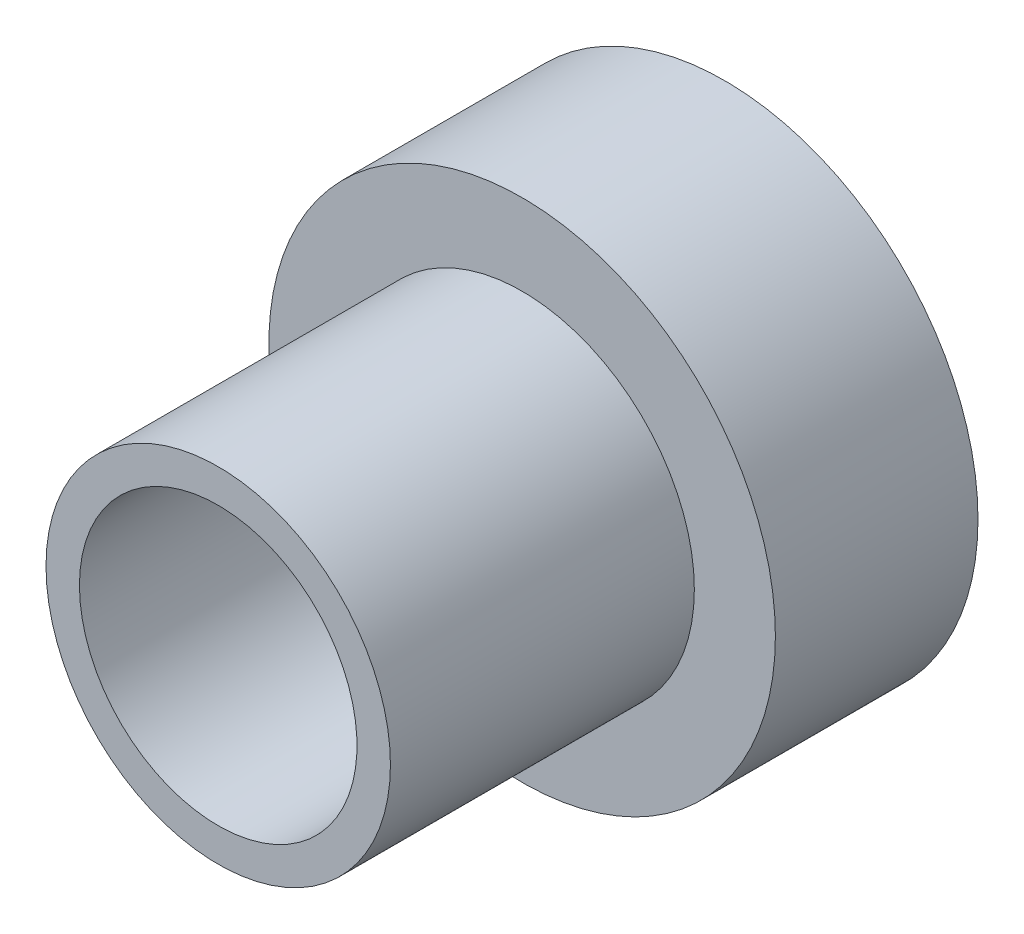
ISO-10303-21;
HEADER;
FILE_DESCRIPTION(('STEP AP214'),'2;1');
FILE_NAME('part.step','',(''),(''),'','','');
FILE_SCHEMA(('AUTOMOTIVE_DESIGN { 1 0 10303 214 1 1 1 1 }'));
ENDSEC;
DATA;
#1=APPLICATION_CONTEXT('core data for automotive mechanical design processes');
#2=APPLICATION_PROTOCOL_DEFINITION('international standard','automotive_design',2000,#1);
#3=PRODUCT_CONTEXT('',#1,'mechanical');
#4=PRODUCT('Part','Part','',(#3));
#5=PRODUCT_RELATED_PRODUCT_CATEGORY('part','',(#4));
#6=PRODUCT_DEFINITION_FORMATION('','',#4);
#7=PRODUCT_DEFINITION_CONTEXT('part definition',#1,'design');
#8=PRODUCT_DEFINITION('design','',#6,#7);
#9=PRODUCT_DEFINITION_SHAPE('','',#8);
#10=(LENGTH_UNIT() NAMED_UNIT(*) SI_UNIT(.MILLI.,.METRE.));
#11=(NAMED_UNIT(*) PLANE_ANGLE_UNIT() SI_UNIT($,.RADIAN.));
#12=(NAMED_UNIT(*) SI_UNIT($,.STERADIAN.) SOLID_ANGLE_UNIT());
#13=UNCERTAINTY_MEASURE_WITH_UNIT(LENGTH_MEASURE(1.E-05),#10,'distance_accuracy_value','');
#14=(GEOMETRIC_REPRESENTATION_CONTEXT(3) GLOBAL_UNCERTAINTY_ASSIGNED_CONTEXT((#13)) GLOBAL_UNIT_ASSIGNED_CONTEXT((#10,
#11,#12)) REPRESENTATION_CONTEXT('',''));
#15=CARTESIAN_POINT('',(0.,0.,0.));
#16=DIRECTION('',(0.,0.,1.));
#17=DIRECTION('',(1.,0.,0.));
#18=AXIS2_PLACEMENT_3D('',#15,#16,#17);
#19=CARTESIAN_POINT('',(0.,0.,12.5));
#20=DIRECTION('',(0.,0.,-1.));
#21=DIRECTION('',(-1.,0.,0.));
#22=AXIS2_PLACEMENT_3D('',#19,#20,#21);
#23=CYLINDRICAL_SURFACE('',#22,12.5);
#24=CARTESIAN_POINT('',(0.,0.,-12.5));
#25=DIRECTION('',(0.,0.,1.));
#26=DIRECTION('',(1.,0.,0.));
#27=AXIS2_PLACEMENT_3D('',#24,#25,#26);
#28=CIRCLE('',#27,12.5);
#29=CARTESIAN_POINT('',(12.5,0.,-12.5));
#30=VERTEX_POINT('',#29);
#31=EDGE_CURVE('E11',#30,#30,#28,.T.);
#32=ORIENTED_EDGE('',*,*,#31,.T.);
#33=EDGE_LOOP('',(#32));
#34=FACE_BOUND('',#33,.T.);
#35=CARTESIAN_POINT('',(0.,0.,-2.5));
#36=DIRECTION('',(0.,0.,1.));
#37=DIRECTION('',(1.,0.,0.));
#38=AXIS2_PLACEMENT_3D('',#35,#36,#37);
#39=CIRCLE('',#38,12.5);
#40=CARTESIAN_POINT('',(12.5,0.,-2.5));
#41=VERTEX_POINT('',#40);
#42=EDGE_CURVE('E34',#41,#41,#39,.T.);
#43=ORIENTED_EDGE('',*,*,#42,.F.);
#44=EDGE_LOOP('',(#43));
#45=FACE_BOUND('',#44,.T.);
#46=ADVANCED_FACE('F31',(#34,#45),#23,.T.);
#47=CARTESIAN_POINT('',(0.,0.,12.5));
#48=DIRECTION('',(0.,0.,1.));
#49=DIRECTION('',(1.,0.,0.));
#50=AXIS2_PLACEMENT_3D('',#47,#48,#49);
#51=PLANE('',#50);
#52=CARTESIAN_POINT('',(0.,0.,12.5));
#53=DIRECTION('',(0.,0.,-1.));
#54=DIRECTION('',(-1.,0.,0.));
#55=AXIS2_PLACEMENT_3D('',#52,#53,#54);
#56=CIRCLE('',#55,6.85);
#57=CARTESIAN_POINT('',(-6.85,0.,12.5));
#58=VERTEX_POINT('',#57);
#59=EDGE_CURVE('E38',#58,#58,#56,.T.);
#60=ORIENTED_EDGE('',*,*,#59,.T.);
#61=EDGE_LOOP('',(#60));
#62=FACE_BOUND('',#61,.T.);
#63=CARTESIAN_POINT('',(0.,0.,12.5));
#64=DIRECTION('',(0.,0.,1.));
#65=DIRECTION('',(1.,0.,0.));
#66=AXIS2_PLACEMENT_3D('',#63,#64,#65);
#67=CIRCLE('',#66,8.5);
#68=CARTESIAN_POINT('',(8.5,0.,12.5));
#69=VERTEX_POINT('',#68);
#70=EDGE_CURVE('E47',#69,#69,#67,.T.);
#71=ORIENTED_EDGE('',*,*,#70,.T.);
#72=EDGE_LOOP('',(#71));
#73=FACE_BOUND('',#72,.T.);
#74=ADVANCED_FACE('F60',(#62,#73),#51,.T.);
#75=CARTESIAN_POINT('',(0.,0.,-12.5));
#76=DIRECTION('',(0.,0.,1.));
#77=DIRECTION('',(1.,0.,0.));
#78=AXIS2_PLACEMENT_3D('',#75,#76,#77);
#79=PLANE('',#78);
#80=CARTESIAN_POINT('',(0.,0.,-12.5));
#81=DIRECTION('',(0.,0.,-1.));
#82=DIRECTION('',(-1.,0.,0.));
#83=AXIS2_PLACEMENT_3D('',#80,#81,#82);
#84=CIRCLE('',#83,6.85);
#85=CARTESIAN_POINT('',(-6.85,0.,-12.5));
#86=VERTEX_POINT('',#85);
#87=EDGE_CURVE('E42',#86,#86,#84,.T.);
#88=ORIENTED_EDGE('',*,*,#87,.F.);
#89=EDGE_LOOP('',(#88));
#90=FACE_BOUND('',#89,.T.);
#91=ORIENTED_EDGE('',*,*,#31,.F.);
#92=EDGE_LOOP('',(#91));
#93=FACE_BOUND('',#92,.T.);
#94=ADVANCED_FACE('F64',(#90,#93),#79,.F.);
#95=CARTESIAN_POINT('',(0.,0.,12.5));
#96=DIRECTION('',(0.,0.,-1.));
#97=DIRECTION('',(-1.,0.,0.));
#98=AXIS2_PLACEMENT_3D('',#95,#96,#97);
#99=CYLINDRICAL_SURFACE('',#98,6.85);
#100=ORIENTED_EDGE('',*,*,#59,.F.);
#101=EDGE_LOOP('',(#100));
#102=FACE_BOUND('',#101,.T.);
#103=ORIENTED_EDGE('',*,*,#87,.T.);
#104=EDGE_LOOP('',(#103));
#105=FACE_BOUND('',#104,.T.);
#106=ADVANCED_FACE('F70',(#102,#105),#99,.F.);
#107=CARTESIAN_POINT('',(0.,0.,-2.5));
#108=DIRECTION('',(0.,0.,1.));
#109=DIRECTION('',(1.,0.,0.));
#110=AXIS2_PLACEMENT_3D('',#107,#108,#109);
#111=PLANE('',#110);
#112=CARTESIAN_POINT('',(0.,0.,-2.5));
#113=DIRECTION('',(0.,0.,1.));
#114=DIRECTION('',(1.,0.,0.));
#115=AXIS2_PLACEMENT_3D('',#112,#113,#114);
#116=CIRCLE('',#115,8.5);
#117=CARTESIAN_POINT('',(8.5,0.,-2.5));
#118=VERTEX_POINT('',#117);
#119=EDGE_CURVE('E50',#118,#118,#116,.T.);
#120=ORIENTED_EDGE('',*,*,#119,.F.);
#121=EDGE_LOOP('',(#120));
#122=FACE_BOUND('',#121,.T.);
#123=ORIENTED_EDGE('',*,*,#42,.T.);
#124=EDGE_LOOP('',(#123));
#125=FACE_BOUND('',#124,.T.);
#126=ADVANCED_FACE('F57',(#122,#125),#111,.T.);
#127=CARTESIAN_POINT('',(0.,0.,-2.5));
#128=DIRECTION('',(0.,0.,1.));
#129=DIRECTION('',(1.,0.,0.));
#130=AXIS2_PLACEMENT_3D('',#127,#128,#129);
#131=CYLINDRICAL_SURFACE('',#130,8.5);
#132=ORIENTED_EDGE('',*,*,#119,.T.);
#133=EDGE_LOOP('',(#132));
#134=FACE_BOUND('',#133,.T.);
#135=ORIENTED_EDGE('',*,*,#70,.F.);
#136=EDGE_LOOP('',(#135));
#137=FACE_BOUND('',#136,.T.);
#138=ADVANCED_FACE('F79',(#134,#137),#131,.T.);
#139=CLOSED_SHELL('',(#46,#74,#94,#106,#126,#138));
#140=MANIFOLD_SOLID_BREP('B2',#139);
#141=ADVANCED_BREP_SHAPE_REPRESENTATION('',(#18,#140),#14);
#142=SHAPE_DEFINITION_REPRESENTATION(#9,#141);
ENDSEC;
END-ISO-10303-21;
